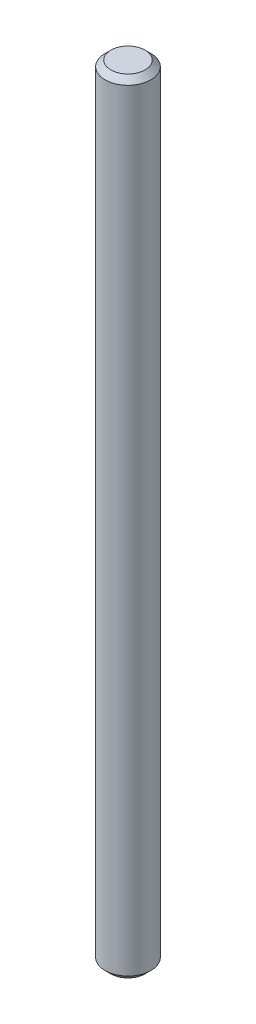
ISO-10303-21;
HEADER;
FILE_DESCRIPTION(('STEP AP214'),'2;1');
FILE_NAME('part.step','',(''),(''),'','','');
FILE_SCHEMA(('AUTOMOTIVE_DESIGN { 1 0 10303 214 1 1 1 1 }'));
ENDSEC;
DATA;
#1=APPLICATION_CONTEXT('core data for automotive mechanical design processes');
#2=APPLICATION_PROTOCOL_DEFINITION('international standard','automotive_design',2000,#1);
#3=PRODUCT_CONTEXT('',#1,'mechanical');
#4=PRODUCT('Part','Part','',(#3));
#5=PRODUCT_RELATED_PRODUCT_CATEGORY('part','',(#4));
#6=PRODUCT_DEFINITION_FORMATION('','',#4);
#7=PRODUCT_DEFINITION_CONTEXT('part definition',#1,'design');
#8=PRODUCT_DEFINITION('design','',#6,#7);
#9=PRODUCT_DEFINITION_SHAPE('','',#8);
#10=(LENGTH_UNIT() NAMED_UNIT(*) SI_UNIT(.MILLI.,.METRE.));
#11=(NAMED_UNIT(*) PLANE_ANGLE_UNIT() SI_UNIT($,.RADIAN.));
#12=(NAMED_UNIT(*) SI_UNIT($,.STERADIAN.) SOLID_ANGLE_UNIT());
#13=UNCERTAINTY_MEASURE_WITH_UNIT(LENGTH_MEASURE(1.E-05),#10,'distance_accuracy_value','');
#14=(GEOMETRIC_REPRESENTATION_CONTEXT(3) GLOBAL_UNCERTAINTY_ASSIGNED_CONTEXT((#13)) GLOBAL_UNIT_ASSIGNED_CONTEXT((#10,
#11,#12)) REPRESENTATION_CONTEXT('',''));
#15=CARTESIAN_POINT('',(0.,0.,0.));
#16=DIRECTION('',(0.,0.,1.));
#17=DIRECTION('',(1.,0.,0.));
#18=AXIS2_PLACEMENT_3D('',#15,#16,#17);
#19=CARTESIAN_POINT('',(0.,108.585,0.));
#20=DIRECTION('',(0.,-1.,0.));
#21=DIRECTION('',(0.,0.,-1.));
#22=AXIS2_PLACEMENT_3D('',#19,#20,#21);
#23=CYLINDRICAL_SURFACE('',#22,3.175);
#24=CARTESIAN_POINT('',(0.,0.793749999999996,0.));
#25=DIRECTION('',(0.,1.,0.));
#26=DIRECTION('',(0.,0.,1.));
#27=AXIS2_PLACEMENT_3D('',#24,#25,#26);
#28=CIRCLE('',#27,3.175);
#29=CARTESIAN_POINT('',(0.,0.793749999999996,3.175));
#30=VERTEX_POINT('',#29);
#31=EDGE_CURVE('E42',#30,#30,#28,.T.);
#32=ORIENTED_EDGE('',*,*,#31,.T.);
#33=EDGE_LOOP('',(#32));
#34=FACE_BOUND('',#33,.T.);
#35=CARTESIAN_POINT('',(0.,107.79125,0.));
#36=DIRECTION('',(0.,1.,0.));
#37=DIRECTION('',(0.,0.,1.));
#38=AXIS2_PLACEMENT_3D('',#35,#36,#37);
#39=CIRCLE('',#38,3.175);
#40=CARTESIAN_POINT('',(0.,107.79125,3.175));
#41=VERTEX_POINT('',#40);
#42=EDGE_CURVE('E46',#41,#41,#39,.F.);
#43=ORIENTED_EDGE('',*,*,#42,.T.);
#44=EDGE_LOOP('',(#43));
#45=FACE_BOUND('',#44,.T.);
#46=ADVANCED_FACE('F31',(#34,#45),#23,.T.);
#47=CARTESIAN_POINT('',(0.,108.585,0.));
#48=DIRECTION('',(0.,1.,0.));
#49=DIRECTION('',(0.,0.,1.));
#50=AXIS2_PLACEMENT_3D('',#47,#48,#49);
#51=PLANE('',#50);
#52=CARTESIAN_POINT('',(0.,108.585,0.));
#53=DIRECTION('',(0.,1.,0.));
#54=DIRECTION('',(0.,0.,1.));
#55=AXIS2_PLACEMENT_3D('',#52,#53,#54);
#56=CIRCLE('',#55,2.38125);
#57=CARTESIAN_POINT('',(0.,108.585,2.38125));
#58=VERTEX_POINT('',#57);
#59=EDGE_CURVE('E10',#58,#58,#56,.T.);
#60=ORIENTED_EDGE('',*,*,#59,.T.);
#61=EDGE_LOOP('',(#60));
#62=FACE_BOUND('',#61,.T.);
#63=ADVANCED_FACE('F62',(#62),#51,.T.);
#64=CARTESIAN_POINT('',(0.,0.,0.));
#65=DIRECTION('',(0.,1.,0.));
#66=DIRECTION('',(0.,0.,1.));
#67=AXIS2_PLACEMENT_3D('',#64,#65,#66);
#68=PLANE('',#67);
#69=CARTESIAN_POINT('',(0.,0.,0.));
#70=DIRECTION('',(0.,1.,0.));
#71=DIRECTION('',(0.,0.,1.));
#72=AXIS2_PLACEMENT_3D('',#69,#70,#71);
#73=CIRCLE('',#72,2.38125);
#74=CARTESIAN_POINT('',(0.,0.,2.38125));
#75=VERTEX_POINT('',#74);
#76=EDGE_CURVE('E38',#75,#75,#73,.F.);
#77=ORIENTED_EDGE('',*,*,#76,.T.);
#78=EDGE_LOOP('',(#77));
#79=FACE_BOUND('',#78,.T.);
#80=ADVANCED_FACE('F59',(#79),#68,.F.);
#81=CARTESIAN_POINT('',(0.,0.793749999999996,0.));
#82=DIRECTION('',(0.,1.,0.));
#83=DIRECTION('',(0.,0.,1.));
#84=AXIS2_PLACEMENT_3D('',#81,#82,#83);
#85=CONICAL_SURFACE('',#84,3.175,0.78539816339745);
#86=ORIENTED_EDGE('',*,*,#76,.F.);
#87=EDGE_LOOP('',(#86));
#88=FACE_BOUND('',#87,.T.);
#89=ORIENTED_EDGE('',*,*,#31,.F.);
#90=EDGE_LOOP('',(#89));
#91=FACE_BOUND('',#90,.T.);
#92=ADVANCED_FACE('F55',(#88,#91),#85,.T.);
#93=CARTESIAN_POINT('',(0.,108.585,0.));
#94=DIRECTION('',(0.,-1.,0.));
#95=DIRECTION('',(0.,0.,-1.));
#96=AXIS2_PLACEMENT_3D('',#93,#94,#95);
#97=CONICAL_SURFACE('',#96,2.38125,0.78539816339745);
#98=ORIENTED_EDGE('',*,*,#42,.F.);
#99=EDGE_LOOP('',(#98));
#100=FACE_BOUND('',#99,.T.);
#101=ORIENTED_EDGE('',*,*,#59,.F.);
#102=EDGE_LOOP('',(#101));
#103=FACE_BOUND('',#102,.T.);
#104=ADVANCED_FACE('F33',(#100,#103),#97,.T.);
#105=CLOSED_SHELL('',(#46,#63,#80,#92,#104));
#106=MANIFOLD_SOLID_BREP('B2',#105);
#107=ADVANCED_BREP_SHAPE_REPRESENTATION('',(#18,#106),#14);
#108=SHAPE_DEFINITION_REPRESENTATION(#9,#107);
ENDSEC;
END-ISO-10303-21;
